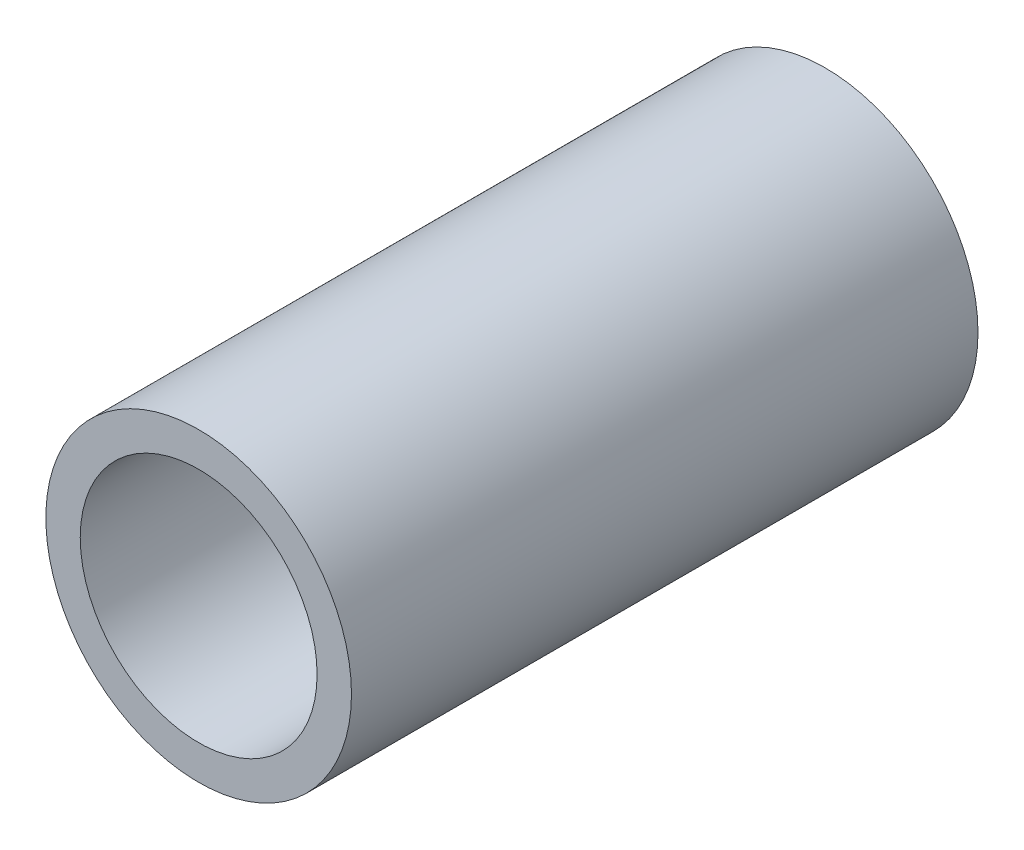
ISO-10303-21;
HEADER;
FILE_DESCRIPTION(('STEP AP214'),'2;1');
FILE_NAME('part.step','',(''),(''),'','','');
FILE_SCHEMA(('AUTOMOTIVE_DESIGN { 1 0 10303 214 1 1 1 1 }'));
ENDSEC;
DATA;
#1=APPLICATION_CONTEXT('core data for automotive mechanical design processes');
#2=APPLICATION_PROTOCOL_DEFINITION('international standard','automotive_design',2000,#1);
#3=PRODUCT_CONTEXT('',#1,'mechanical');
#4=PRODUCT('Part','Part','',(#3));
#5=PRODUCT_RELATED_PRODUCT_CATEGORY('part','',(#4));
#6=PRODUCT_DEFINITION_FORMATION('','',#4);
#7=PRODUCT_DEFINITION_CONTEXT('part definition',#1,'design');
#8=PRODUCT_DEFINITION('design','',#6,#7);
#9=PRODUCT_DEFINITION_SHAPE('','',#8);
#10=(LENGTH_UNIT() NAMED_UNIT(*) SI_UNIT(.MILLI.,.METRE.));
#11=(NAMED_UNIT(*) PLANE_ANGLE_UNIT() SI_UNIT($,.RADIAN.));
#12=(NAMED_UNIT(*) SI_UNIT($,.STERADIAN.) SOLID_ANGLE_UNIT());
#13=UNCERTAINTY_MEASURE_WITH_UNIT(LENGTH_MEASURE(1.E-05),#10,'distance_accuracy_value','');
#14=(GEOMETRIC_REPRESENTATION_CONTEXT(3) GLOBAL_UNCERTAINTY_ASSIGNED_CONTEXT((#13)) GLOBAL_UNIT_ASSIGNED_CONTEXT((#10,
#11,#12)) REPRESENTATION_CONTEXT('',''));
#15=CARTESIAN_POINT('',(0.,0.,0.));
#16=DIRECTION('',(0.,0.,1.));
#17=DIRECTION('',(1.,0.,0.));
#18=AXIS2_PLACEMENT_3D('',#15,#16,#17);
#19=CARTESIAN_POINT('',(0.,0.,41.));
#20=DIRECTION('',(0.,0.,-1.));
#21=DIRECTION('',(-1.,0.,0.));
#22=AXIS2_PLACEMENT_3D('',#19,#20,#21);
#23=CYLINDRICAL_SURFACE('',#22,15.5);
#24=CARTESIAN_POINT('',(0.,0.,41.));
#25=DIRECTION('',(0.,0.,-1.));
#26=DIRECTION('',(1.,0.,0.));
#27=AXIS2_PLACEMENT_3D('',#24,#25,#26);
#28=CIRCLE('',#27,15.5);
#29=CARTESIAN_POINT('',(15.5,0.,41.));
#30=VERTEX_POINT('',#29);
#31=EDGE_CURVE('E10',#30,#30,#28,.T.);
#32=ORIENTED_EDGE('',*,*,#31,.F.);
#33=EDGE_LOOP('',(#32));
#34=FACE_BOUND('',#33,.T.);
#35=CARTESIAN_POINT('',(0.,0.,-41.));
#36=DIRECTION('',(0.,0.,-1.));
#37=DIRECTION('',(1.,0.,0.));
#38=AXIS2_PLACEMENT_3D('',#35,#36,#37);
#39=CIRCLE('',#38,15.5);
#40=CARTESIAN_POINT('',(15.5,0.,-41.));
#41=VERTEX_POINT('',#40);
#42=EDGE_CURVE('E25',#41,#41,#39,.T.);
#43=ORIENTED_EDGE('',*,*,#42,.T.);
#44=EDGE_LOOP('',(#43));
#45=FACE_BOUND('',#44,.T.);
#46=ADVANCED_FACE('F14',(#34,#45),#23,.F.);
#47=CARTESIAN_POINT('',(0.,0.,41.));
#48=DIRECTION('',(0.,0.,-1.));
#49=DIRECTION('',(-1.,0.,0.));
#50=AXIS2_PLACEMENT_3D('',#47,#48,#49);
#51=CYLINDRICAL_SURFACE('',#50,20.);
#52=CARTESIAN_POINT('',(0.,0.,41.));
#53=DIRECTION('',(0.,0.,-1.));
#54=DIRECTION('',(1.,0.,0.));
#55=AXIS2_PLACEMENT_3D('',#52,#53,#54);
#56=CIRCLE('',#55,20.);
#57=CARTESIAN_POINT('',(20.,0.,41.));
#58=VERTEX_POINT('',#57);
#59=EDGE_CURVE('E21',#58,#58,#56,.T.);
#60=ORIENTED_EDGE('',*,*,#59,.T.);
#61=EDGE_LOOP('',(#60));
#62=FACE_BOUND('',#61,.T.);
#63=CARTESIAN_POINT('',(0.,0.,-41.));
#64=DIRECTION('',(0.,0.,-1.));
#65=DIRECTION('',(1.,0.,0.));
#66=AXIS2_PLACEMENT_3D('',#63,#64,#65);
#67=CIRCLE('',#66,20.);
#68=CARTESIAN_POINT('',(20.,0.,-41.));
#69=VERTEX_POINT('',#68);
#70=EDGE_CURVE('E30',#69,#69,#67,.T.);
#71=ORIENTED_EDGE('',*,*,#70,.F.);
#72=EDGE_LOOP('',(#71));
#73=FACE_BOUND('',#72,.T.);
#74=ADVANCED_FACE('F16',(#62,#73),#51,.T.);
#75=CARTESIAN_POINT('',(0.,0.,41.));
#76=DIRECTION('',(0.,0.,-1.));
#77=DIRECTION('',(-1.,0.,0.));
#78=AXIS2_PLACEMENT_3D('',#75,#76,#77);
#79=PLANE('',#78);
#80=ORIENTED_EDGE('',*,*,#31,.T.);
#81=EDGE_LOOP('',(#80));
#82=FACE_BOUND('',#81,.T.);
#83=ORIENTED_EDGE('',*,*,#59,.F.);
#84=EDGE_LOOP('',(#83));
#85=FACE_BOUND('',#84,.T.);
#86=ADVANCED_FACE('F42',(#82,#85),#79,.F.);
#87=CARTESIAN_POINT('',(0.,0.,-41.));
#88=DIRECTION('',(0.,0.,-1.));
#89=DIRECTION('',(-1.,0.,0.));
#90=AXIS2_PLACEMENT_3D('',#87,#88,#89);
#91=PLANE('',#90);
#92=ORIENTED_EDGE('',*,*,#42,.F.);
#93=EDGE_LOOP('',(#92));
#94=FACE_BOUND('',#93,.T.);
#95=ORIENTED_EDGE('',*,*,#70,.T.);
#96=EDGE_LOOP('',(#95));
#97=FACE_BOUND('',#96,.T.);
#98=ADVANCED_FACE('F39',(#94,#97),#91,.T.);
#99=CLOSED_SHELL('',(#46,#74,#86,#98));
#100=MANIFOLD_SOLID_BREP('B1',#99);
#101=ADVANCED_BREP_SHAPE_REPRESENTATION('',(#18,#100),#14);
#102=SHAPE_DEFINITION_REPRESENTATION(#9,#101);
ENDSEC;
END-ISO-10303-21;
